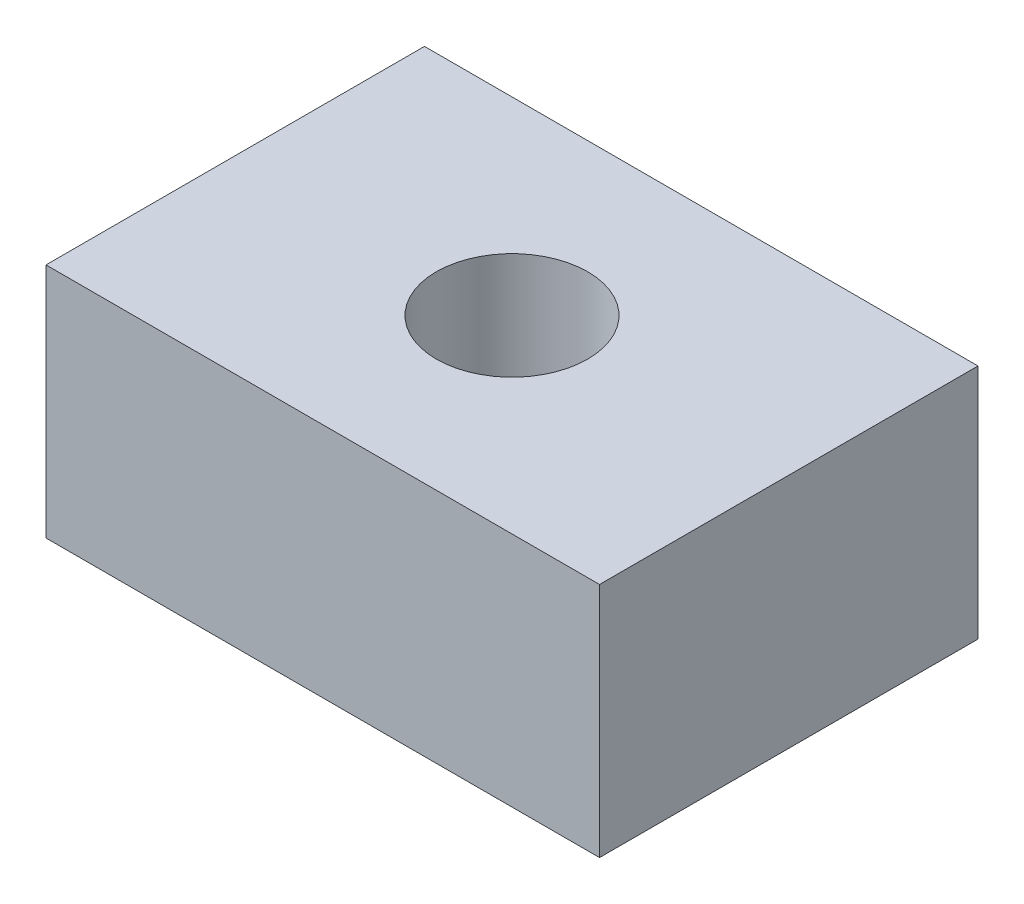
ISO-10303-21;
HEADER;
FILE_DESCRIPTION(('STEP AP214'),'2;1');
FILE_NAME('part.step','',(''),(''),'','','');
FILE_SCHEMA(('AUTOMOTIVE_DESIGN { 1 0 10303 214 1 1 1 1 }'));
ENDSEC;
DATA;
#1=APPLICATION_CONTEXT('core data for automotive mechanical design processes');
#2=APPLICATION_PROTOCOL_DEFINITION('international standard','automotive_design',2000,#1);
#3=PRODUCT_CONTEXT('',#1,'mechanical');
#4=PRODUCT('Part','Part','',(#3));
#5=PRODUCT_RELATED_PRODUCT_CATEGORY('part','',(#4));
#6=PRODUCT_DEFINITION_FORMATION('','',#4);
#7=PRODUCT_DEFINITION_CONTEXT('part definition',#1,'design');
#8=PRODUCT_DEFINITION('design','',#6,#7);
#9=PRODUCT_DEFINITION_SHAPE('','',#8);
#10=(LENGTH_UNIT() NAMED_UNIT(*) SI_UNIT(.MILLI.,.METRE.));
#11=(NAMED_UNIT(*) PLANE_ANGLE_UNIT() SI_UNIT($,.RADIAN.));
#12=(NAMED_UNIT(*) SI_UNIT($,.STERADIAN.) SOLID_ANGLE_UNIT());
#13=UNCERTAINTY_MEASURE_WITH_UNIT(LENGTH_MEASURE(1.E-05),#10,'distance_accuracy_value','');
#14=(GEOMETRIC_REPRESENTATION_CONTEXT(3) GLOBAL_UNCERTAINTY_ASSIGNED_CONTEXT((#13)) GLOBAL_UNIT_ASSIGNED_CONTEXT((#10,
#11,#12)) REPRESENTATION_CONTEXT('',''));
#15=CARTESIAN_POINT('',(0.,0.,0.));
#16=DIRECTION('',(0.,0.,1.));
#17=DIRECTION('',(1.,0.,0.));
#18=AXIS2_PLACEMENT_3D('',#15,#16,#17);
#19=CARTESIAN_POINT('',(5.85,5.,-4.));
#20=DIRECTION('',(-1.,0.,0.));
#21=DIRECTION('',(0.,0.,1.));
#22=AXIS2_PLACEMENT_3D('',#19,#20,#21);
#23=PLANE('',#22);
#24=DIRECTION('',(0.,0.,-1.));
#25=VECTOR('',#24,1.);
#26=CARTESIAN_POINT('',(5.85,0.,-4.));
#27=LINE('',#26,#25);
#28=CARTESIAN_POINT('',(5.85,0.,4.));
#29=VERTEX_POINT('',#28);
#30=CARTESIAN_POINT('',(5.85,0.,-4.));
#31=VERTEX_POINT('',#30);
#32=EDGE_CURVE('E96',#29,#31,#27,.T.);
#33=ORIENTED_EDGE('',*,*,#32,.T.);
#34=DIRECTION('',(0.,-1.,0.));
#35=VECTOR('',#34,1.);
#36=CARTESIAN_POINT('',(5.85,5.,-4.));
#37=LINE('',#36,#35);
#38=CARTESIAN_POINT('',(5.85,5.,-4.));
#39=VERTEX_POINT('',#38);
#40=EDGE_CURVE('E11',#39,#31,#37,.T.);
#41=ORIENTED_EDGE('',*,*,#40,.F.);
#42=DIRECTION('',(0.,0.,-1.));
#43=VECTOR('',#42,1.);
#44=CARTESIAN_POINT('',(5.85,5.,-4.));
#45=LINE('',#44,#43);
#46=CARTESIAN_POINT('',(5.85,5.,4.));
#47=VERTEX_POINT('',#46);
#48=EDGE_CURVE('E84',#47,#39,#45,.T.);
#49=ORIENTED_EDGE('',*,*,#48,.F.);
#50=DIRECTION('',(0.,-1.,0.));
#51=VECTOR('',#50,1.);
#52=CARTESIAN_POINT('',(5.85,5.,4.));
#53=LINE('',#52,#51);
#54=EDGE_CURVE('E92',#47,#29,#53,.T.);
#55=ORIENTED_EDGE('',*,*,#54,.T.);
#56=EDGE_LOOP('',(#33,#41,#49,#55));
#57=FACE_BOUND('',#56,.T.);
#58=ADVANCED_FACE('F33',(#57),#23,.F.);
#59=CARTESIAN_POINT('',(-5.85,5.,-4.));
#60=DIRECTION('',(0.,0.,1.));
#61=DIRECTION('',(1.,0.,0.));
#62=AXIS2_PLACEMENT_3D('',#59,#60,#61);
#63=PLANE('',#62);
#64=DIRECTION('',(-1.,0.,0.));
#65=VECTOR('',#64,1.);
#66=CARTESIAN_POINT('',(-5.85,0.,-4.));
#67=LINE('',#66,#65);
#68=CARTESIAN_POINT('',(-5.85,0.,-4.));
#69=VERTEX_POINT('',#68);
#70=EDGE_CURVE('E88',#31,#69,#67,.T.);
#71=ORIENTED_EDGE('',*,*,#70,.T.);
#72=DIRECTION('',(0.,-1.,0.));
#73=VECTOR('',#72,1.);
#74=CARTESIAN_POINT('',(-5.85,5.,-4.));
#75=LINE('',#74,#73);
#76=CARTESIAN_POINT('',(-5.85,5.,-4.));
#77=VERTEX_POINT('',#76);
#78=EDGE_CURVE('E41',#77,#69,#75,.T.);
#79=ORIENTED_EDGE('',*,*,#78,.F.);
#80=DIRECTION('',(-1.,0.,0.));
#81=VECTOR('',#80,1.);
#82=CARTESIAN_POINT('',(-5.85,5.,-4.));
#83=LINE('',#82,#81);
#84=EDGE_CURVE('E79',#39,#77,#83,.T.);
#85=ORIENTED_EDGE('',*,*,#84,.F.);
#86=ORIENTED_EDGE('',*,*,#40,.T.);
#87=EDGE_LOOP('',(#71,#79,#85,#86));
#88=FACE_BOUND('',#87,.T.);
#89=ADVANCED_FACE('F87',(#88),#63,.F.);
#90=CARTESIAN_POINT('',(-5.85,5.,-4.));
#91=DIRECTION('',(1.,0.,0.));
#92=DIRECTION('',(0.,0.,-1.));
#93=AXIS2_PLACEMENT_3D('',#90,#91,#92);
#94=PLANE('',#93);
#95=DIRECTION('',(0.,0.,1.));
#96=VECTOR('',#95,1.);
#97=CARTESIAN_POINT('',(-5.85,0.,-4.));
#98=LINE('',#97,#96);
#99=CARTESIAN_POINT('',(-5.85,0.,4.));
#100=VERTEX_POINT('',#99);
#101=EDGE_CURVE('E66',#69,#100,#98,.T.);
#102=ORIENTED_EDGE('',*,*,#101,.T.);
#103=DIRECTION('',(0.,-1.,0.));
#104=VECTOR('',#103,1.);
#105=CARTESIAN_POINT('',(-5.85,5.,4.));
#106=LINE('',#105,#104);
#107=CARTESIAN_POINT('',(-5.85,5.,4.));
#108=VERTEX_POINT('',#107);
#109=EDGE_CURVE('E89',#108,#100,#106,.T.);
#110=ORIENTED_EDGE('',*,*,#109,.F.);
#111=DIRECTION('',(0.,0.,1.));
#112=VECTOR('',#111,1.);
#113=CARTESIAN_POINT('',(-5.85,5.,-4.));
#114=LINE('',#113,#112);
#115=EDGE_CURVE('E82',#77,#108,#114,.T.);
#116=ORIENTED_EDGE('',*,*,#115,.F.);
#117=ORIENTED_EDGE('',*,*,#78,.T.);
#118=EDGE_LOOP('',(#102,#110,#116,#117));
#119=FACE_BOUND('',#118,.T.);
#120=ADVANCED_FACE('F90',(#119),#94,.F.);
#121=CARTESIAN_POINT('',(-5.85,5.,4.));
#122=DIRECTION('',(0.,0.,-1.));
#123=DIRECTION('',(-1.,0.,0.));
#124=AXIS2_PLACEMENT_3D('',#121,#122,#123);
#125=PLANE('',#124);
#126=DIRECTION('',(1.,0.,0.));
#127=VECTOR('',#126,1.);
#128=CARTESIAN_POINT('',(-5.85,0.,4.));
#129=LINE('',#128,#127);
#130=EDGE_CURVE('E72',#100,#29,#129,.T.);
#131=ORIENTED_EDGE('',*,*,#130,.T.);
#132=ORIENTED_EDGE('',*,*,#54,.F.);
#133=DIRECTION('',(1.,0.,0.));
#134=VECTOR('',#133,1.);
#135=CARTESIAN_POINT('',(-5.85,5.,4.));
#136=LINE('',#135,#134);
#137=EDGE_CURVE('E49',#108,#47,#136,.T.);
#138=ORIENTED_EDGE('',*,*,#137,.F.);
#139=ORIENTED_EDGE('',*,*,#109,.T.);
#140=EDGE_LOOP('',(#131,#132,#138,#139));
#141=FACE_BOUND('',#140,.T.);
#142=ADVANCED_FACE('F104',(#141),#125,.F.);
#143=CARTESIAN_POINT('',(0.,5.,0.));
#144=DIRECTION('',(0.,1.,0.));
#145=DIRECTION('',(0.,0.,1.));
#146=AXIS2_PLACEMENT_3D('',#143,#144,#145);
#147=PLANE('',#146);
#148=CARTESIAN_POINT('',(0.,5.,0.));
#149=DIRECTION('',(0.,1.,0.));
#150=DIRECTION('',(0.,0.,1.));
#151=AXIS2_PLACEMENT_3D('',#148,#149,#150);
#152=CIRCLE('',#151,1.6);
#153=CARTESIAN_POINT('',(0.,5.,1.6));
#154=VERTEX_POINT('',#153);
#155=EDGE_CURVE('E110',#154,#154,#152,.T.);
#156=ORIENTED_EDGE('',*,*,#155,.F.);
#157=EDGE_LOOP('',(#156));
#158=FACE_BOUND('',#157,.T.);
#159=ORIENTED_EDGE('',*,*,#48,.T.);
#160=ORIENTED_EDGE('',*,*,#84,.T.);
#161=ORIENTED_EDGE('',*,*,#115,.T.);
#162=ORIENTED_EDGE('',*,*,#137,.T.);
#163=EDGE_LOOP('',(#159,#160,#161,#162));
#164=FACE_BOUND('',#163,.T.);
#165=ADVANCED_FACE('F80',(#158,#164),#147,.T.);
#166=CARTESIAN_POINT('',(0.,0.,0.));
#167=DIRECTION('',(0.,1.,0.));
#168=DIRECTION('',(0.,0.,1.));
#169=AXIS2_PLACEMENT_3D('',#166,#167,#168);
#170=PLANE('',#169);
#171=CARTESIAN_POINT('',(0.,0.,0.));
#172=DIRECTION('',(0.,1.,0.));
#173=DIRECTION('',(0.,0.,1.));
#174=AXIS2_PLACEMENT_3D('',#171,#172,#173);
#175=CIRCLE('',#174,1.6);
#176=CARTESIAN_POINT('',(0.,0.,1.6));
#177=VERTEX_POINT('',#176);
#178=EDGE_CURVE('E99',#177,#177,#175,.T.);
#179=ORIENTED_EDGE('',*,*,#178,.T.);
#180=EDGE_LOOP('',(#179));
#181=FACE_BOUND('',#180,.T.);
#182=ORIENTED_EDGE('',*,*,#32,.F.);
#183=ORIENTED_EDGE('',*,*,#130,.F.);
#184=ORIENTED_EDGE('',*,*,#101,.F.);
#185=ORIENTED_EDGE('',*,*,#70,.F.);
#186=EDGE_LOOP('',(#182,#183,#184,#185));
#187=FACE_BOUND('',#186,.T.);
#188=ADVANCED_FACE('F107',(#181,#187),#170,.F.);
#189=CARTESIAN_POINT('',(0.,0.,0.));
#190=DIRECTION('',(0.,1.,0.));
#191=DIRECTION('',(0.,0.,1.));
#192=AXIS2_PLACEMENT_3D('',#189,#190,#191);
#193=CYLINDRICAL_SURFACE('',#192,1.6);
#194=ORIENTED_EDGE('',*,*,#178,.F.);
#195=EDGE_LOOP('',(#194));
#196=FACE_BOUND('',#195,.T.);
#197=ORIENTED_EDGE('',*,*,#155,.T.);
#198=EDGE_LOOP('',(#197));
#199=FACE_BOUND('',#198,.T.);
#200=ADVANCED_FACE('F117',(#196,#199),#193,.F.);
#201=CLOSED_SHELL('',(#58,#89,#120,#142,#165,#188,#200));
#202=MANIFOLD_SOLID_BREP('B2',#201);
#203=ADVANCED_BREP_SHAPE_REPRESENTATION('',(#18,#202),#14);
#204=SHAPE_DEFINITION_REPRESENTATION(#9,#203);
ENDSEC;
END-ISO-10303-21;
